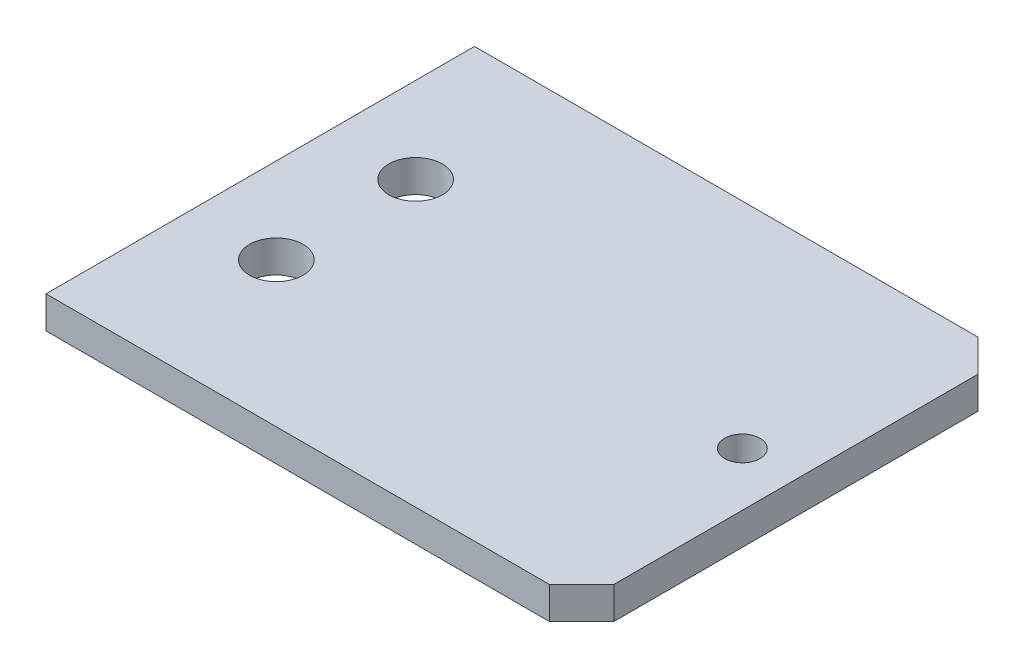
ISO-10303-21;
HEADER;
FILE_DESCRIPTION(('STEP AP214'),'2;1');
FILE_NAME('part.step','',(''),(''),'','','');
FILE_SCHEMA(('AUTOMOTIVE_DESIGN { 1 0 10303 214 1 1 1 1 }'));
ENDSEC;
DATA;
#1=APPLICATION_CONTEXT('core data for automotive mechanical design processes');
#2=APPLICATION_PROTOCOL_DEFINITION('international standard','automotive_design',2000,#1);
#3=PRODUCT_CONTEXT('',#1,'mechanical');
#4=PRODUCT('Part','Part','',(#3));
#5=PRODUCT_RELATED_PRODUCT_CATEGORY('part','',(#4));
#6=PRODUCT_DEFINITION_FORMATION('','',#4);
#7=PRODUCT_DEFINITION_CONTEXT('part definition',#1,'design');
#8=PRODUCT_DEFINITION('design','',#6,#7);
#9=PRODUCT_DEFINITION_SHAPE('','',#8);
#10=(LENGTH_UNIT() NAMED_UNIT(*) SI_UNIT(.MILLI.,.METRE.));
#11=(NAMED_UNIT(*) PLANE_ANGLE_UNIT() SI_UNIT($,.RADIAN.));
#12=(NAMED_UNIT(*) SI_UNIT($,.STERADIAN.) SOLID_ANGLE_UNIT());
#13=UNCERTAINTY_MEASURE_WITH_UNIT(LENGTH_MEASURE(1.E-05),#10,'distance_accuracy_value','');
#14=(GEOMETRIC_REPRESENTATION_CONTEXT(3) GLOBAL_UNCERTAINTY_ASSIGNED_CONTEXT((#13)) GLOBAL_UNIT_ASSIGNED_CONTEXT((#10,
#11,#12)) REPRESENTATION_CONTEXT('',''));
#15=CARTESIAN_POINT('',(0.,0.,0.));
#16=DIRECTION('',(0.,0.,1.));
#17=DIRECTION('',(1.,0.,0.));
#18=AXIS2_PLACEMENT_3D('',#15,#16,#17);
#19=CARTESIAN_POINT('',(0.,-3.,0.));
#20=DIRECTION('',(-1.,0.,0.));
#21=DIRECTION('',(0.,0.,1.));
#22=AXIS2_PLACEMENT_3D('',#19,#20,#21);
#23=PLANE('',#22);
#24=DIRECTION('',(0.,0.,1.));
#25=VECTOR('',#24,1.);
#26=CARTESIAN_POINT('',(0.,0.,0.));
#27=LINE('',#26,#25);
#28=CARTESIAN_POINT('',(0.,0.,-40.));
#29=VERTEX_POINT('',#28);
#30=CARTESIAN_POINT('',(0.,0.,0.));
#31=VERTEX_POINT('',#30);
#32=EDGE_CURVE('E137',#29,#31,#27,.T.);
#33=ORIENTED_EDGE('',*,*,#32,.F.);
#34=DIRECTION('',(0.,1.,0.));
#35=VECTOR('',#34,1.);
#36=CARTESIAN_POINT('',(0.,-3.,-40.));
#37=LINE('',#36,#35);
#38=CARTESIAN_POINT('',(0.,-3.,-40.));
#39=VERTEX_POINT('',#38);
#40=EDGE_CURVE('E11',#39,#29,#37,.T.);
#41=ORIENTED_EDGE('',*,*,#40,.F.);
#42=DIRECTION('',(0.,0.,1.));
#43=VECTOR('',#42,1.);
#44=CARTESIAN_POINT('',(0.,-3.,0.));
#45=LINE('',#44,#43);
#46=CARTESIAN_POINT('',(0.,-3.,0.));
#47=VERTEX_POINT('',#46);
#48=EDGE_CURVE('E158',#39,#47,#45,.T.);
#49=ORIENTED_EDGE('',*,*,#48,.T.);
#50=DIRECTION('',(0.,1.,0.));
#51=VECTOR('',#50,1.);
#52=CARTESIAN_POINT('',(0.,-3.,0.));
#53=LINE('',#52,#51);
#54=EDGE_CURVE('E47',#47,#31,#53,.T.);
#55=ORIENTED_EDGE('',*,*,#54,.T.);
#56=EDGE_LOOP('',(#33,#41,#49,#55));
#57=FACE_BOUND('',#56,.T.);
#58=ADVANCED_FACE('F44',(#57),#23,.T.);
#59=CARTESIAN_POINT('',(0.,-3.,-40.));
#60=DIRECTION('',(0.,0.,-1.));
#61=DIRECTION('',(-1.,0.,0.));
#62=AXIS2_PLACEMENT_3D('',#59,#60,#61);
#63=PLANE('',#62);
#64=DIRECTION('',(-1.,0.,0.));
#65=VECTOR('',#64,1.);
#66=CARTESIAN_POINT('',(0.,0.,-40.));
#67=LINE('',#66,#65);
#68=CARTESIAN_POINT('',(47.,0.,-40.));
#69=VERTEX_POINT('',#68);
#70=EDGE_CURVE('E155',#69,#29,#67,.T.);
#71=ORIENTED_EDGE('',*,*,#70,.F.);
#72=DIRECTION('',(0.,1.,0.));
#73=VECTOR('',#72,1.);
#74=CARTESIAN_POINT('',(47.,-3.,-40.));
#75=LINE('',#74,#73);
#76=CARTESIAN_POINT('',(47.,-3.,-40.));
#77=VERTEX_POINT('',#76);
#78=EDGE_CURVE('E54',#77,#69,#75,.T.);
#79=ORIENTED_EDGE('',*,*,#78,.F.);
#80=DIRECTION('',(-1.,0.,0.));
#81=VECTOR('',#80,1.);
#82=CARTESIAN_POINT('',(0.,-3.,-40.));
#83=LINE('',#82,#81);
#84=EDGE_CURVE('E121',#77,#39,#83,.T.);
#85=ORIENTED_EDGE('',*,*,#84,.T.);
#86=ORIENTED_EDGE('',*,*,#40,.T.);
#87=EDGE_LOOP('',(#71,#79,#85,#86));
#88=FACE_BOUND('',#87,.T.);
#89=ADVANCED_FACE('F174',(#88),#63,.T.);
#90=CARTESIAN_POINT('',(47.,-3.,-40.));
#91=DIRECTION('',(0.707106781186548,0.,-0.707106781186548));
#92=DIRECTION('',(-0.707106781186548,0.,-0.707106781186548));
#93=AXIS2_PLACEMENT_3D('',#90,#91,#92);
#94=PLANE('',#93);
#95=DIRECTION('',(-0.707106781186547,0.,-0.707106781186547));
#96=VECTOR('',#95,1.);
#97=CARTESIAN_POINT('',(47.,0.,-40.));
#98=LINE('',#97,#96);
#99=CARTESIAN_POINT('',(50.,0.,-37.));
#100=VERTEX_POINT('',#99);
#101=EDGE_CURVE('E107',#100,#69,#98,.T.);
#102=ORIENTED_EDGE('',*,*,#101,.F.);
#103=DIRECTION('',(0.,1.,0.));
#104=VECTOR('',#103,1.);
#105=CARTESIAN_POINT('',(50.,-3.,-37.));
#106=LINE('',#105,#104);
#107=CARTESIAN_POINT('',(50.,-3.,-37.));
#108=VERTEX_POINT('',#107);
#109=EDGE_CURVE('E102',#108,#100,#106,.T.);
#110=ORIENTED_EDGE('',*,*,#109,.F.);
#111=DIRECTION('',(-0.707106781186547,0.,-0.707106781186547));
#112=VECTOR('',#111,1.);
#113=CARTESIAN_POINT('',(47.,-3.,-40.));
#114=LINE('',#113,#112);
#115=EDGE_CURVE('E105',#108,#77,#114,.T.);
#116=ORIENTED_EDGE('',*,*,#115,.T.);
#117=ORIENTED_EDGE('',*,*,#78,.T.);
#118=EDGE_LOOP('',(#102,#110,#116,#117));
#119=FACE_BOUND('',#118,.T.);
#120=ADVANCED_FACE('F104',(#119),#94,.T.);
#121=CARTESIAN_POINT('',(50.,-3.,-3.));
#122=DIRECTION('',(1.,0.,0.));
#123=DIRECTION('',(0.,0.,-1.));
#124=AXIS2_PLACEMENT_3D('',#121,#122,#123);
#125=PLANE('',#124);
#126=DIRECTION('',(0.,0.,-1.));
#127=VECTOR('',#126,1.);
#128=CARTESIAN_POINT('',(50.,0.,-3.));
#129=LINE('',#128,#127);
#130=CARTESIAN_POINT('',(50.,0.,-3.));
#131=VERTEX_POINT('',#130);
#132=EDGE_CURVE('E150',#131,#100,#129,.T.);
#133=ORIENTED_EDGE('',*,*,#132,.F.);
#134=DIRECTION('',(0.,1.,0.));
#135=VECTOR('',#134,1.);
#136=CARTESIAN_POINT('',(50.,-3.,-3.));
#137=LINE('',#136,#135);
#138=CARTESIAN_POINT('',(50.,-3.,-3.));
#139=VERTEX_POINT('',#138);
#140=EDGE_CURVE('E113',#139,#131,#137,.T.);
#141=ORIENTED_EDGE('',*,*,#140,.F.);
#142=DIRECTION('',(0.,0.,-1.));
#143=VECTOR('',#142,1.);
#144=CARTESIAN_POINT('',(50.,-3.,-3.));
#145=LINE('',#144,#143);
#146=EDGE_CURVE('E119',#139,#108,#145,.T.);
#147=ORIENTED_EDGE('',*,*,#146,.T.);
#148=ORIENTED_EDGE('',*,*,#109,.T.);
#149=EDGE_LOOP('',(#133,#141,#147,#148));
#150=FACE_BOUND('',#149,.T.);
#151=ADVANCED_FACE('F124',(#150),#125,.T.);
#152=CARTESIAN_POINT('',(47.,-3.,0.));
#153=DIRECTION('',(0.707106781186547,0.,0.707106781186548));
#154=DIRECTION('',(0.707106781186548,0.,-0.707106781186547));
#155=AXIS2_PLACEMENT_3D('',#152,#153,#154);
#156=PLANE('',#155);
#157=DIRECTION('',(0.707106781186548,0.,-0.707106781186547));
#158=VECTOR('',#157,1.);
#159=CARTESIAN_POINT('',(47.,0.,0.));
#160=LINE('',#159,#158);
#161=CARTESIAN_POINT('',(47.,0.,0.));
#162=VERTEX_POINT('',#161);
#163=EDGE_CURVE('E146',#162,#131,#160,.T.);
#164=ORIENTED_EDGE('',*,*,#163,.F.);
#165=DIRECTION('',(0.,1.,0.));
#166=VECTOR('',#165,1.);
#167=CARTESIAN_POINT('',(47.,-3.,0.));
#168=LINE('',#167,#166);
#169=CARTESIAN_POINT('',(47.,-3.,0.));
#170=VERTEX_POINT('',#169);
#171=EDGE_CURVE('E163',#170,#162,#168,.T.);
#172=ORIENTED_EDGE('',*,*,#171,.F.);
#173=DIRECTION('',(0.707106781186548,0.,-0.707106781186547));
#174=VECTOR('',#173,1.);
#175=CARTESIAN_POINT('',(47.,-3.,0.));
#176=LINE('',#175,#174);
#177=EDGE_CURVE('E126',#170,#139,#176,.T.);
#178=ORIENTED_EDGE('',*,*,#177,.T.);
#179=ORIENTED_EDGE('',*,*,#140,.T.);
#180=EDGE_LOOP('',(#164,#172,#178,#179));
#181=FACE_BOUND('',#180,.T.);
#182=ADVANCED_FACE('F187',(#181),#156,.T.);
#183=CARTESIAN_POINT('',(0.,-3.,0.));
#184=DIRECTION('',(0.,0.,1.));
#185=DIRECTION('',(1.,0.,0.));
#186=AXIS2_PLACEMENT_3D('',#183,#184,#185);
#187=PLANE('',#186);
#188=DIRECTION('',(1.,0.,0.));
#189=VECTOR('',#188,1.);
#190=CARTESIAN_POINT('',(0.,0.,0.));
#191=LINE('',#190,#189);
#192=EDGE_CURVE('E141',#31,#162,#191,.T.);
#193=ORIENTED_EDGE('',*,*,#192,.F.);
#194=ORIENTED_EDGE('',*,*,#54,.F.);
#195=DIRECTION('',(1.,0.,0.));
#196=VECTOR('',#195,1.);
#197=CARTESIAN_POINT('',(0.,-3.,0.));
#198=LINE('',#197,#196);
#199=EDGE_CURVE('E131',#47,#170,#198,.T.);
#200=ORIENTED_EDGE('',*,*,#199,.T.);
#201=ORIENTED_EDGE('',*,*,#171,.T.);
#202=EDGE_LOOP('',(#193,#194,#200,#201));
#203=FACE_BOUND('',#202,.T.);
#204=ADVANCED_FACE('F171',(#203),#187,.T.);
#205=CARTESIAN_POINT('',(0.,-3.,0.));
#206=DIRECTION('',(0.,-1.,0.));
#207=DIRECTION('',(0.,0.,-1.));
#208=AXIS2_PLACEMENT_3D('',#205,#206,#207);
#209=PLANE('',#208);
#210=CARTESIAN_POINT('',(8.,-3.,-13.5));
#211=DIRECTION('',(0.,1.,0.));
#212=DIRECTION('',(0.,0.,1.));
#213=AXIS2_PLACEMENT_3D('',#210,#211,#212);
#214=CIRCLE('',#213,2.49999999999999);
#215=CARTESIAN_POINT('',(8.,-3.,-11.));
#216=VERTEX_POINT('',#215);
#217=EDGE_CURVE('E217',#216,#216,#214,.T.);
#218=ORIENTED_EDGE('',*,*,#217,.T.);
#219=EDGE_LOOP('',(#218));
#220=FACE_BOUND('',#219,.T.);
#221=CARTESIAN_POINT('',(8.,-3.,-26.5));
#222=DIRECTION('',(0.,1.,0.));
#223=DIRECTION('',(0.,0.,1.));
#224=AXIS2_PLACEMENT_3D('',#221,#222,#223);
#225=CIRCLE('',#224,2.49999999999999);
#226=CARTESIAN_POINT('',(8.,-3.,-24.));
#227=VERTEX_POINT('',#226);
#228=EDGE_CURVE('E232',#227,#227,#225,.T.);
#229=ORIENTED_EDGE('',*,*,#228,.T.);
#230=EDGE_LOOP('',(#229));
#231=FACE_BOUND('',#230,.T.);
#232=CARTESIAN_POINT('',(45.,-3.,-20.));
#233=DIRECTION('',(0.,1.,0.));
#234=DIRECTION('',(0.,0.,1.));
#235=AXIS2_PLACEMENT_3D('',#232,#233,#234);
#236=CIRCLE('',#235,1.65);
#237=CARTESIAN_POINT('',(45.,-3.,-18.35));
#238=VERTEX_POINT('',#237);
#239=EDGE_CURVE('E142',#238,#238,#236,.T.);
#240=ORIENTED_EDGE('',*,*,#239,.T.);
#241=EDGE_LOOP('',(#240));
#242=FACE_BOUND('',#241,.T.);
#243=ORIENTED_EDGE('',*,*,#48,.F.);
#244=ORIENTED_EDGE('',*,*,#84,.F.);
#245=ORIENTED_EDGE('',*,*,#115,.F.);
#246=ORIENTED_EDGE('',*,*,#146,.F.);
#247=ORIENTED_EDGE('',*,*,#177,.F.);
#248=ORIENTED_EDGE('',*,*,#199,.F.);
#249=EDGE_LOOP('',(#243,#244,#245,#246,#247,#248));
#250=FACE_BOUND('',#249,.T.);
#251=ADVANCED_FACE('F117',(#220,#231,#242,#250),#209,.T.);
#252=CARTESIAN_POINT('',(0.,0.,0.));
#253=DIRECTION('',(0.,-1.,0.));
#254=DIRECTION('',(0.,0.,-1.));
#255=AXIS2_PLACEMENT_3D('',#252,#253,#254);
#256=PLANE('',#255);
#257=CARTESIAN_POINT('',(8.,0.,-13.5));
#258=DIRECTION('',(0.,1.,0.));
#259=DIRECTION('',(0.,0.,1.));
#260=AXIS2_PLACEMENT_3D('',#257,#258,#259);
#261=CIRCLE('',#260,2.49999999999999);
#262=CARTESIAN_POINT('',(8.,0.,-11.));
#263=VERTEX_POINT('',#262);
#264=EDGE_CURVE('E220',#263,#263,#261,.T.);
#265=ORIENTED_EDGE('',*,*,#264,.F.);
#266=EDGE_LOOP('',(#265));
#267=FACE_BOUND('',#266,.T.);
#268=CARTESIAN_POINT('',(8.,0.,-26.5));
#269=DIRECTION('',(0.,1.,0.));
#270=DIRECTION('',(0.,0.,1.));
#271=AXIS2_PLACEMENT_3D('',#268,#269,#270);
#272=CIRCLE('',#271,2.49999999999999);
#273=CARTESIAN_POINT('',(8.,0.,-24.));
#274=VERTEX_POINT('',#273);
#275=EDGE_CURVE('E226',#274,#274,#272,.T.);
#276=ORIENTED_EDGE('',*,*,#275,.F.);
#277=EDGE_LOOP('',(#276));
#278=FACE_BOUND('',#277,.T.);
#279=CARTESIAN_POINT('',(45.,0.,-20.));
#280=DIRECTION('',(0.,1.,0.));
#281=DIRECTION('',(0.,0.,1.));
#282=AXIS2_PLACEMENT_3D('',#279,#280,#281);
#283=CIRCLE('',#282,1.65);
#284=CARTESIAN_POINT('',(45.,0.,-18.35));
#285=VERTEX_POINT('',#284);
#286=EDGE_CURVE('E236',#285,#285,#283,.T.);
#287=ORIENTED_EDGE('',*,*,#286,.F.);
#288=EDGE_LOOP('',(#287));
#289=FACE_BOUND('',#288,.T.);
#290=ORIENTED_EDGE('',*,*,#32,.T.);
#291=ORIENTED_EDGE('',*,*,#192,.T.);
#292=ORIENTED_EDGE('',*,*,#163,.T.);
#293=ORIENTED_EDGE('',*,*,#132,.T.);
#294=ORIENTED_EDGE('',*,*,#101,.T.);
#295=ORIENTED_EDGE('',*,*,#70,.T.);
#296=EDGE_LOOP('',(#290,#291,#292,#293,#294,#295));
#297=FACE_BOUND('',#296,.T.);
#298=ADVANCED_FACE('F173',(#267,#278,#289,#297),#256,.F.);
#299=CARTESIAN_POINT('',(45.,0.,-20.));
#300=DIRECTION('',(0.,1.,0.));
#301=DIRECTION('',(0.,0.,1.));
#302=AXIS2_PLACEMENT_3D('',#299,#300,#301);
#303=CYLINDRICAL_SURFACE('',#302,1.65);
#304=ORIENTED_EDGE('',*,*,#239,.F.);
#305=EDGE_LOOP('',(#304));
#306=FACE_BOUND('',#305,.T.);
#307=ORIENTED_EDGE('',*,*,#286,.T.);
#308=EDGE_LOOP('',(#307));
#309=FACE_BOUND('',#308,.T.);
#310=ADVANCED_FACE('F198',(#306,#309),#303,.F.);
#311=CARTESIAN_POINT('',(8.,0.,-26.5));
#312=DIRECTION('',(0.,1.,0.));
#313=DIRECTION('',(0.,0.,1.));
#314=AXIS2_PLACEMENT_3D('',#311,#312,#313);
#315=CYLINDRICAL_SURFACE('',#314,2.49999999999999);
#316=ORIENTED_EDGE('',*,*,#228,.F.);
#317=EDGE_LOOP('',(#316));
#318=FACE_BOUND('',#317,.T.);
#319=ORIENTED_EDGE('',*,*,#275,.T.);
#320=EDGE_LOOP('',(#319));
#321=FACE_BOUND('',#320,.T.);
#322=ADVANCED_FACE('F205',(#318,#321),#315,.F.);
#323=CARTESIAN_POINT('',(8.,0.,-13.5));
#324=DIRECTION('',(0.,1.,0.));
#325=DIRECTION('',(0.,0.,1.));
#326=AXIS2_PLACEMENT_3D('',#323,#324,#325);
#327=CYLINDRICAL_SURFACE('',#326,2.49999999999999);
#328=ORIENTED_EDGE('',*,*,#217,.F.);
#329=EDGE_LOOP('',(#328));
#330=FACE_BOUND('',#329,.T.);
#331=ORIENTED_EDGE('',*,*,#264,.T.);
#332=EDGE_LOOP('',(#331));
#333=FACE_BOUND('',#332,.T.);
#334=ADVANCED_FACE('F209',(#330,#333),#327,.F.);
#335=CLOSED_SHELL('',(#58,#89,#120,#151,#182,#204,#251,#298,#310,#322,#334));
#336=MANIFOLD_SOLID_BREP('B2',#335);
#337=ADVANCED_BREP_SHAPE_REPRESENTATION('',(#18,#336),#14);
#338=SHAPE_DEFINITION_REPRESENTATION(#9,#337);
ENDSEC;
END-ISO-10303-21;
